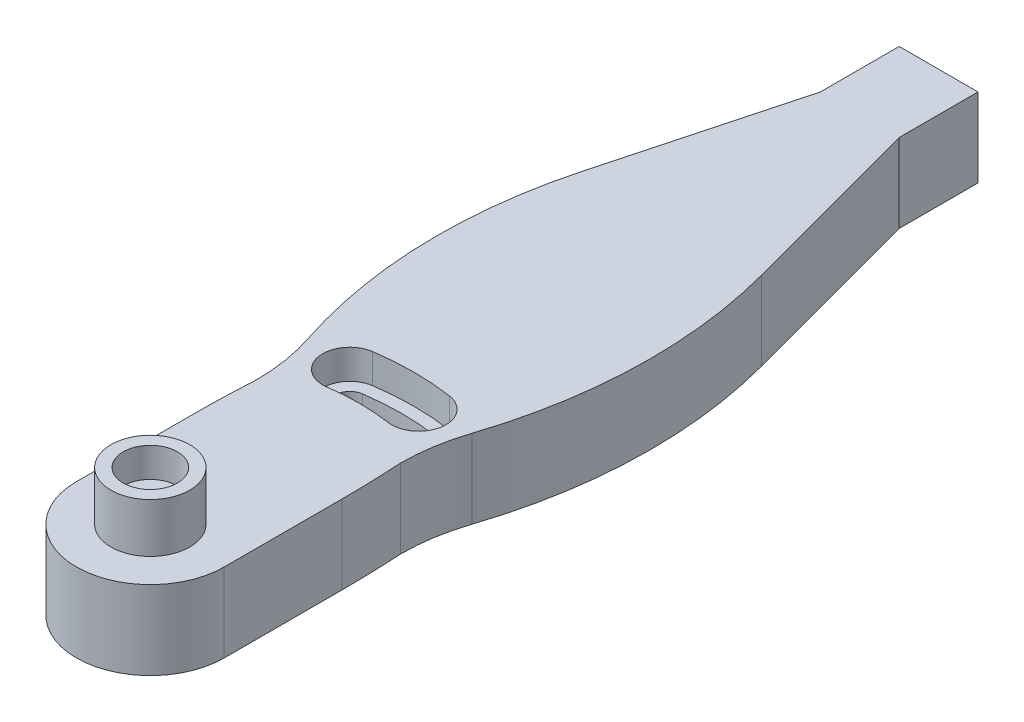
ISO-10303-21;
HEADER;
FILE_DESCRIPTION(('STEP AP214'),'2;1');
FILE_NAME('part.step','',(''),(''),'','','');
FILE_SCHEMA(('AUTOMOTIVE_DESIGN { 1 0 10303 214 1 1 1 1 }'));
ENDSEC;
DATA;
#1=APPLICATION_CONTEXT('core data for automotive mechanical design processes');
#2=APPLICATION_PROTOCOL_DEFINITION('international standard','automotive_design',2000,#1);
#3=PRODUCT_CONTEXT('',#1,'mechanical');
#4=PRODUCT('Part','Part','',(#3));
#5=PRODUCT_RELATED_PRODUCT_CATEGORY('part','',(#4));
#6=PRODUCT_DEFINITION_FORMATION('','',#4);
#7=PRODUCT_DEFINITION_CONTEXT('part definition',#1,'design');
#8=PRODUCT_DEFINITION('design','',#6,#7);
#9=PRODUCT_DEFINITION_SHAPE('','',#8);
#10=(LENGTH_UNIT() NAMED_UNIT(*) SI_UNIT(.MILLI.,.METRE.));
#11=(NAMED_UNIT(*) PLANE_ANGLE_UNIT() SI_UNIT($,.RADIAN.));
#12=(NAMED_UNIT(*) SI_UNIT($,.STERADIAN.) SOLID_ANGLE_UNIT());
#13=UNCERTAINTY_MEASURE_WITH_UNIT(LENGTH_MEASURE(1.E-05),#10,'distance_accuracy_value','');
#14=(GEOMETRIC_REPRESENTATION_CONTEXT(3) GLOBAL_UNCERTAINTY_ASSIGNED_CONTEXT((#13)) GLOBAL_UNIT_ASSIGNED_CONTEXT((#10,
#11,#12)) REPRESENTATION_CONTEXT('',''));
#15=CARTESIAN_POINT('',(0.,0.,0.));
#16=DIRECTION('',(0.,0.,1.));
#17=DIRECTION('',(1.,0.,0.));
#18=AXIS2_PLACEMENT_3D('',#15,#16,#17);
#19=CARTESIAN_POINT('',(0.,8.,0.));
#20=DIRECTION('',(0.,-1.,0.));
#21=DIRECTION('',(0.,0.,-1.));
#22=AXIS2_PLACEMENT_3D('',#19,#20,#21);
#23=CYLINDRICAL_SURFACE('',#22,25.5);
#24=DIRECTION('',(0.,-1.,0.));
#25=VECTOR('',#24,1.);
#26=CARTESIAN_POINT('',(3.71875,8.,-25.2273838999905));
#27=LINE('',#26,#25);
#28=CARTESIAN_POINT('',(3.71875,5.,-25.2273838999905));
#29=VERTEX_POINT('',#28);
#30=CARTESIAN_POINT('',(3.71875,0.,-25.2273838999905));
#31=VERTEX_POINT('',#30);
#32=EDGE_CURVE('E51',#29,#31,#27,.T.);
#33=ORIENTED_EDGE('',*,*,#32,.F.);
#34=CARTESIAN_POINT('',(0.,5.,0.));
#35=DIRECTION('',(0.,1.,0.));
#36=DIRECTION('',(0.,0.,1.));
#37=AXIS2_PLACEMENT_3D('',#34,#35,#36);
#38=CIRCLE('',#37,25.5);
#39=CARTESIAN_POINT('',(-3.71875,5.,-25.2273838999905));
#40=VERTEX_POINT('',#39);
#41=EDGE_CURVE('E233',#29,#40,#38,.T.);
#42=ORIENTED_EDGE('',*,*,#41,.T.);
#43=DIRECTION('',(0.,-1.,0.));
#44=VECTOR('',#43,1.);
#45=CARTESIAN_POINT('',(-3.71875,8.,-25.2273838999905));
#46=LINE('',#45,#44);
#47=CARTESIAN_POINT('',(-3.71875,0.,-25.2273838999905));
#48=VERTEX_POINT('',#47);
#49=EDGE_CURVE('E344',#40,#48,#46,.T.);
#50=ORIENTED_EDGE('',*,*,#49,.T.);
#51=CARTESIAN_POINT('',(0.,0.,0.));
#52=DIRECTION('',(0.,1.,0.));
#53=DIRECTION('',(0.,0.,1.));
#54=AXIS2_PLACEMENT_3D('',#51,#52,#53);
#55=CIRCLE('',#54,25.5);
#56=EDGE_CURVE('E330',#31,#48,#55,.T.);
#57=ORIENTED_EDGE('',*,*,#56,.F.);
#58=EDGE_LOOP('',(#33,#42,#50,#57));
#59=FACE_BOUND('',#58,.T.);
#60=ADVANCED_FACE('F43',(#59),#23,.F.);
#61=CARTESIAN_POINT('',(3.5,8.,-23.7434201411675));
#62=DIRECTION('',(0.,-1.,0.));
#63=DIRECTION('',(0.,0.,-1.));
#64=AXIS2_PLACEMENT_3D('',#61,#62,#63);
#65=CYLINDRICAL_SURFACE('',#64,1.5);
#66=DIRECTION('',(0.,-1.,0.));
#67=VECTOR('',#66,1.);
#68=CARTESIAN_POINT('',(3.28125,8.,-22.2594563823446));
#69=LINE('',#68,#67);
#70=CARTESIAN_POINT('',(3.28125,5.,-22.2594563823446));
#71=VERTEX_POINT('',#70);
#72=CARTESIAN_POINT('',(3.28125,0.,-22.2594563823446));
#73=VERTEX_POINT('',#72);
#74=EDGE_CURVE('E349',#71,#73,#69,.T.);
#75=ORIENTED_EDGE('',*,*,#74,.F.);
#76=CARTESIAN_POINT('',(3.5,5.,-23.7434201411675));
#77=DIRECTION('',(0.,1.,0.));
#78=DIRECTION('',(0.,0.,1.));
#79=AXIS2_PLACEMENT_3D('',#76,#77,#78);
#80=CIRCLE('',#79,1.5);
#81=EDGE_CURVE('E230',#71,#29,#80,.T.);
#82=ORIENTED_EDGE('',*,*,#81,.T.);
#83=ORIENTED_EDGE('',*,*,#32,.T.);
#84=CARTESIAN_POINT('',(3.5,0.,-23.7434201411675));
#85=DIRECTION('',(0.,1.,0.));
#86=DIRECTION('',(0.,0.,1.));
#87=AXIS2_PLACEMENT_3D('',#84,#85,#86);
#88=CIRCLE('',#87,1.5);
#89=EDGE_CURVE('E333',#73,#31,#88,.T.);
#90=ORIENTED_EDGE('',*,*,#89,.F.);
#91=EDGE_LOOP('',(#75,#82,#83,#90));
#92=FACE_BOUND('',#91,.T.);
#93=ADVANCED_FACE('F453',(#92),#65,.F.);
#94=CARTESIAN_POINT('',(0.,8.,0.));
#95=DIRECTION('',(0.,-1.,0.));
#96=DIRECTION('',(0.,0.,-1.));
#97=AXIS2_PLACEMENT_3D('',#94,#95,#96);
#98=CYLINDRICAL_SURFACE('',#97,22.5);
#99=CARTESIAN_POINT('',(0.,5.,0.));
#100=DIRECTION('',(0.,1.,0.));
#101=DIRECTION('',(0.,0.,1.));
#102=AXIS2_PLACEMENT_3D('',#99,#100,#101);
#103=CIRCLE('',#102,22.5);
#104=CARTESIAN_POINT('',(-3.28125,5.,-22.2594563823446));
#105=VERTEX_POINT('',#104);
#106=EDGE_CURVE('E66',#71,#105,#103,.T.);
#107=ORIENTED_EDGE('',*,*,#106,.F.);
#108=ORIENTED_EDGE('',*,*,#74,.T.);
#109=CARTESIAN_POINT('',(0.,0.,0.));
#110=DIRECTION('',(0.,1.,0.));
#111=DIRECTION('',(0.,0.,1.));
#112=AXIS2_PLACEMENT_3D('',#109,#110,#111);
#113=CIRCLE('',#112,22.5);
#114=CARTESIAN_POINT('',(-3.28125,0.,-22.2594563823446));
#115=VERTEX_POINT('',#114);
#116=EDGE_CURVE('E336',#73,#115,#113,.T.);
#117=ORIENTED_EDGE('',*,*,#116,.T.);
#118=DIRECTION('',(0.,-1.,0.));
#119=VECTOR('',#118,1.);
#120=CARTESIAN_POINT('',(-3.28125,8.,-22.2594563823446));
#121=LINE('',#120,#119);
#122=EDGE_CURVE('E346',#105,#115,#121,.T.);
#123=ORIENTED_EDGE('',*,*,#122,.F.);
#124=EDGE_LOOP('',(#107,#108,#117,#123));
#125=FACE_BOUND('',#124,.T.);
#126=ADVANCED_FACE('F459',(#125),#98,.T.);
#127=CARTESIAN_POINT('',(-3.5,8.,-23.7434201411675));
#128=DIRECTION('',(0.,-1.,0.));
#129=DIRECTION('',(0.,0.,-1.));
#130=AXIS2_PLACEMENT_3D('',#127,#128,#129);
#131=CYLINDRICAL_SURFACE('',#130,1.5);
#132=ORIENTED_EDGE('',*,*,#49,.F.);
#133=CARTESIAN_POINT('',(-3.5,5.,-23.7434201411675));
#134=DIRECTION('',(0.,1.,0.));
#135=DIRECTION('',(0.,0.,1.));
#136=AXIS2_PLACEMENT_3D('',#133,#134,#135);
#137=CIRCLE('',#136,1.5);
#138=EDGE_CURVE('E11',#40,#105,#137,.T.);
#139=ORIENTED_EDGE('',*,*,#138,.T.);
#140=ORIENTED_EDGE('',*,*,#122,.T.);
#141=CARTESIAN_POINT('',(-3.5,0.,-23.7434201411675));
#142=DIRECTION('',(0.,1.,0.));
#143=DIRECTION('',(0.,0.,1.));
#144=AXIS2_PLACEMENT_3D('',#141,#142,#143);
#145=CIRCLE('',#144,1.5);
#146=EDGE_CURVE('E339',#48,#115,#145,.T.);
#147=ORIENTED_EDGE('',*,*,#146,.F.);
#148=EDGE_LOOP('',(#132,#139,#140,#147));
#149=FACE_BOUND('',#148,.T.);
#150=ADVANCED_FACE('F631',(#149),#131,.F.);
#151=CARTESIAN_POINT('',(0.,10.,0.));
#152=DIRECTION('',(0.,1.,0.));
#153=DIRECTION('',(0.,0.,1.));
#154=AXIS2_PLACEMENT_3D('',#151,#152,#153);
#155=PLANE('',#154);
#156=CARTESIAN_POINT('',(0.,10.,0.));
#157=DIRECTION('',(0.,1.,0.));
#158=DIRECTION('',(0.,0.,1.));
#159=AXIS2_PLACEMENT_3D('',#156,#157,#158);
#160=CIRCLE('',#159,1.5);
#161=CARTESIAN_POINT('',(0.,10.,1.5));
#162=VERTEX_POINT('',#161);
#163=EDGE_CURVE('E245',#162,#162,#160,.T.);
#164=ORIENTED_EDGE('',*,*,#163,.F.);
#165=EDGE_LOOP('',(#164));
#166=FACE_BOUND('',#165,.T.);
#167=CARTESIAN_POINT('',(0.,10.,0.));
#168=DIRECTION('',(0.,1.,0.));
#169=DIRECTION('',(0.,0.,1.));
#170=AXIS2_PLACEMENT_3D('',#167,#168,#169);
#171=CIRCLE('',#170,2.75);
#172=CARTESIAN_POINT('',(0.,10.,2.75));
#173=VERTEX_POINT('',#172);
#174=EDGE_CURVE('E236',#173,#173,#171,.T.);
#175=ORIENTED_EDGE('',*,*,#174,.T.);
#176=EDGE_LOOP('',(#175));
#177=FACE_BOUND('',#176,.T.);
#178=ADVANCED_FACE('F639',(#166,#177),#155,.T.);
#179=CARTESIAN_POINT('',(0.,8.,0.));
#180=DIRECTION('',(0.,1.,0.));
#181=DIRECTION('',(0.,0.,1.));
#182=AXIS2_PLACEMENT_3D('',#179,#180,#181);
#183=PLANE('',#182);
#184=CARTESIAN_POINT('',(0.,8.,0.));
#185=DIRECTION('',(0.,-1.,0.));
#186=DIRECTION('',(0.,0.,1.));
#187=AXIS2_PLACEMENT_3D('',#184,#185,#186);
#188=CIRCLE('',#187,21.25);
#189=CARTESIAN_POINT('',(-3.09895833333333,8.,-21.0228199166588));
#190=VERTEX_POINT('',#189);
#191=CARTESIAN_POINT('',(3.09895833333333,8.,-21.0228199166588));
#192=VERTEX_POINT('',#191);
#193=EDGE_CURVE('E58',#190,#192,#188,.T.);
#194=ORIENTED_EDGE('',*,*,#193,.F.);
#195=CARTESIAN_POINT('',(-3.5,8.,-23.7434201411675));
#196=DIRECTION('',(0.,1.,0.));
#197=DIRECTION('',(0.,0.,1.));
#198=AXIS2_PLACEMENT_3D('',#195,#196,#197);
#199=CIRCLE('',#198,2.75);
#200=CARTESIAN_POINT('',(-3.90104166666667,8.,-26.4640203656763));
#201=VERTEX_POINT('',#200);
#202=EDGE_CURVE('E211',#201,#190,#199,.T.);
#203=ORIENTED_EDGE('',*,*,#202,.F.);
#204=CARTESIAN_POINT('',(0.,8.,0.));
#205=DIRECTION('',(0.,1.,0.));
#206=DIRECTION('',(0.,0.,1.));
#207=AXIS2_PLACEMENT_3D('',#204,#205,#206);
#208=CIRCLE('',#207,26.75);
#209=CARTESIAN_POINT('',(3.90104166666667,8.,-26.4640203656763));
#210=VERTEX_POINT('',#209);
#211=EDGE_CURVE('E214',#210,#201,#208,.T.);
#212=ORIENTED_EDGE('',*,*,#211,.F.);
#213=CARTESIAN_POINT('',(3.5,8.,-23.7434201411675));
#214=DIRECTION('',(0.,1.,0.));
#215=DIRECTION('',(0.,0.,1.));
#216=AXIS2_PLACEMENT_3D('',#213,#214,#215);
#217=CIRCLE('',#216,2.75);
#218=EDGE_CURVE('E220',#192,#210,#217,.T.);
#219=ORIENTED_EDGE('',*,*,#218,.F.);
#220=EDGE_LOOP('',(#194,#203,#212,#219));
#221=FACE_BOUND('',#220,.T.);
#222=CARTESIAN_POINT('',(39.1768262293694,8.,-39.9529439397651));
#223=DIRECTION('',(0.,1.,0.));
#224=DIRECTION('',(0.,0.,1.));
#225=AXIS2_PLACEMENT_3D('',#222,#223,#224);
#226=CIRCLE('',#225,50.);
#227=CARTESIAN_POINT('',(-8.31520099184699,8.,-24.3162131299302));
#228=VERTEX_POINT('',#227);
#229=CARTESIAN_POINT('',(-9.11946508508407,8.,-52.8938961948908));
#230=VERTEX_POINT('',#229);
#231=EDGE_CURVE('E252',#228,#230,#226,.F.);
#232=ORIENTED_EDGE('',*,*,#231,.F.);
#233=CARTESIAN_POINT('',(-27.3120118803336,8.,-18.0615208059963));
#234=DIRECTION('',(0.,1.,0.));
#235=DIRECTION('',(0.,0.,1.));
#236=AXIS2_PLACEMENT_3D('',#233,#234,#235);
#237=CIRCLE('',#236,20.);
#238=CARTESIAN_POINT('',(-7.31201188033354,8.,-18.0615208059967));
#239=VERTEX_POINT('',#238);
#240=EDGE_CURVE('E255',#239,#228,#237,.T.);
#241=ORIENTED_EDGE('',*,*,#240,.F.);
#242=CARTESIAN_POINT('',(92.5,8.,-11.9327130589583));
#243=DIRECTION('',(0.,1.,0.));
#244=DIRECTION('',(0.,0.,1.));
#245=AXIS2_PLACEMENT_3D('',#242,#243,#244);
#246=CIRCLE('',#245,100.);
#247=CARTESIAN_POINT('',(-7.5,8.,-11.932713058958));
#248=VERTEX_POINT('',#247);
#249=EDGE_CURVE('E259',#248,#239,#246,.F.);
#250=ORIENTED_EDGE('',*,*,#249,.F.);
#251=DIRECTION('',(0.,0.,-1.));
#252=VECTOR('',#251,1.);
#253=CARTESIAN_POINT('',(-7.5,8.,0.));
#254=LINE('',#253,#252);
#255=CARTESIAN_POINT('',(-7.5,8.,0.));
#256=VERTEX_POINT('',#255);
#257=EDGE_CURVE('E262',#256,#248,#254,.T.);
#258=ORIENTED_EDGE('',*,*,#257,.F.);
#259=CARTESIAN_POINT('',(0.,8.,0.));
#260=DIRECTION('',(0.,1.,0.));
#261=DIRECTION('',(0.,0.,1.));
#262=AXIS2_PLACEMENT_3D('',#259,#260,#261);
#263=CIRCLE('',#262,7.5);
#264=CARTESIAN_POINT('',(7.5,8.,0.));
#265=VERTEX_POINT('',#264);
#266=EDGE_CURVE('E265',#256,#265,#263,.T.);
#267=ORIENTED_EDGE('',*,*,#266,.T.);
#268=DIRECTION('',(0.,0.,-1.));
#269=VECTOR('',#268,1.);
#270=CARTESIAN_POINT('',(7.5,8.,0.));
#271=LINE('',#270,#269);
#272=CARTESIAN_POINT('',(7.5,8.,-11.932713058958));
#273=VERTEX_POINT('',#272);
#274=EDGE_CURVE('E267',#265,#273,#271,.T.);
#275=ORIENTED_EDGE('',*,*,#274,.T.);
#276=CARTESIAN_POINT('',(-92.5,8.,-11.9327130589583));
#277=DIRECTION('',(0.,1.,0.));
#278=DIRECTION('',(0.,0.,1.));
#279=AXIS2_PLACEMENT_3D('',#276,#277,#278);
#280=CIRCLE('',#279,100.);
#281=CARTESIAN_POINT('',(7.31201188033354,8.,-18.0615208059967));
#282=VERTEX_POINT('',#281);
#283=EDGE_CURVE('E269',#273,#282,#280,.T.);
#284=ORIENTED_EDGE('',*,*,#283,.T.);
#285=CARTESIAN_POINT('',(27.3120118803336,8.,-18.0615208059963));
#286=DIRECTION('',(0.,1.,0.));
#287=DIRECTION('',(0.,0.,1.));
#288=AXIS2_PLACEMENT_3D('',#285,#286,#287);
#289=CIRCLE('',#288,20.);
#290=CARTESIAN_POINT('',(8.31520099184698,8.,-24.3162131299302));
#291=VERTEX_POINT('',#290);
#292=EDGE_CURVE('E271',#291,#282,#289,.T.);
#293=ORIENTED_EDGE('',*,*,#292,.F.);
#294=CARTESIAN_POINT('',(-39.1768262293694,8.,-39.952943939765));
#295=DIRECTION('',(0.,1.,0.));
#296=DIRECTION('',(0.,0.,1.));
#297=AXIS2_PLACEMENT_3D('',#294,#295,#296);
#298=CIRCLE('',#297,50.);
#299=CARTESIAN_POINT('',(9.11946508508407,8.,-52.8938961948908));
#300=VERTEX_POINT('',#299);
#301=EDGE_CURVE('E274',#291,#300,#298,.T.);
#302=ORIENTED_EDGE('',*,*,#301,.T.);
#303=DIRECTION('',(0.258819045102514,0.,0.96592582628907));
#304=VECTOR('',#303,1.);
#305=CARTESIAN_POINT('',(21.7320508075685,8.,-5.82308546375995));
#306=LINE('',#305,#304);
#307=CARTESIAN_POINT('',(3.99999999999999,8.,-72.));
#308=VERTEX_POINT('',#307);
#309=EDGE_CURVE('E276',#308,#300,#306,.T.);
#310=ORIENTED_EDGE('',*,*,#309,.F.);
#311=DIRECTION('',(0.,0.,1.));
#312=VECTOR('',#311,1.);
#313=CARTESIAN_POINT('',(4.00000000000001,8.,0.));
#314=LINE('',#313,#312);
#315=CARTESIAN_POINT('',(3.99999999999999,8.,-80.));
#316=VERTEX_POINT('',#315);
#317=EDGE_CURVE('E279',#316,#308,#314,.T.);
#318=ORIENTED_EDGE('',*,*,#317,.F.);
#319=DIRECTION('',(1.,0.,0.));
#320=VECTOR('',#319,1.);
#321=CARTESIAN_POINT('',(0.,8.,-80.));
#322=LINE('',#321,#320);
#323=CARTESIAN_POINT('',(-4.00000000000001,8.,-80.));
#324=VERTEX_POINT('',#323);
#325=EDGE_CURVE('E282',#324,#316,#322,.T.);
#326=ORIENTED_EDGE('',*,*,#325,.F.);
#327=DIRECTION('',(0.,0.,-1.));
#328=VECTOR('',#327,1.);
#329=CARTESIAN_POINT('',(-4.00000000000001,8.,0.));
#330=LINE('',#329,#328);
#331=CARTESIAN_POINT('',(-4.00000000000001,8.,-72.));
#332=VERTEX_POINT('',#331);
#333=EDGE_CURVE('E285',#332,#324,#330,.T.);
#334=ORIENTED_EDGE('',*,*,#333,.F.);
#335=DIRECTION('',(-0.258819045102514,0.,0.96592582628907));
#336=VECTOR('',#335,1.);
#337=CARTESIAN_POINT('',(-21.7320508075685,8.,-5.82308546375995));
#338=LINE('',#337,#336);
#339=EDGE_CURVE('E288',#332,#230,#338,.T.);
#340=ORIENTED_EDGE('',*,*,#339,.T.);
#341=EDGE_LOOP('',(#232,#241,#250,#258,#267,#275,#284,#293,#302,#310,#318,#326,#334,#340));
#342=FACE_BOUND('',#341,.T.);
#343=CARTESIAN_POINT('',(0.,8.,0.));
#344=DIRECTION('',(0.,1.,0.));
#345=DIRECTION('',(0.,0.,1.));
#346=AXIS2_PLACEMENT_3D('',#343,#344,#345);
#347=CIRCLE('',#346,4.);
#348=CARTESIAN_POINT('',(0.,8.,4.));
#349=VERTEX_POINT('',#348);
#350=EDGE_CURVE('E248',#349,#349,#347,.T.);
#351=ORIENTED_EDGE('',*,*,#350,.F.);
#352=EDGE_LOOP('',(#351));
#353=FACE_BOUND('',#352,.T.);
#354=ADVANCED_FACE('F397',(#221,#342,#353),#183,.T.);
#355=CARTESIAN_POINT('',(39.1768262293694,8.,-39.9529439397651));
#356=DIRECTION('',(0.,-1.,0.));
#357=DIRECTION('',(0.,0.,-1.));
#358=AXIS2_PLACEMENT_3D('',#355,#356,#357);
#359=CYLINDRICAL_SURFACE('',#358,50.);
#360=CARTESIAN_POINT('',(39.1768262293694,0.,-39.9529439397651));
#361=DIRECTION('',(0.,1.,0.));
#362=DIRECTION('',(0.,0.,1.));
#363=AXIS2_PLACEMENT_3D('',#360,#361,#362);
#364=CIRCLE('',#363,50.);
#365=CARTESIAN_POINT('',(-8.31520099184699,0.,-24.3162131299302));
#366=VERTEX_POINT('',#365);
#367=CARTESIAN_POINT('',(-9.11946508508407,0.,-52.8938961948908));
#368=VERTEX_POINT('',#367);
#369=EDGE_CURVE('E251',#366,#368,#364,.F.);
#370=ORIENTED_EDGE('',*,*,#369,.F.);
#371=DIRECTION('',(0.,-1.,0.));
#372=VECTOR('',#371,1.);
#373=CARTESIAN_POINT('',(-8.31520099184699,8.,-24.3162131299302));
#374=LINE('',#373,#372);
#375=EDGE_CURVE('E347',#228,#366,#374,.T.);
#376=ORIENTED_EDGE('',*,*,#375,.F.);
#377=ORIENTED_EDGE('',*,*,#231,.T.);
#378=DIRECTION('',(0.,-1.,0.));
#379=VECTOR('',#378,1.);
#380=CARTESIAN_POINT('',(-9.11946508508407,8.,-52.8938961948908));
#381=LINE('',#380,#379);
#382=EDGE_CURVE('E290',#230,#368,#381,.T.);
#383=ORIENTED_EDGE('',*,*,#382,.T.);
#384=EDGE_LOOP('',(#370,#376,#377,#383));
#385=FACE_BOUND('',#384,.T.);
#386=ADVANCED_FACE('F45',(#385),#359,.T.);
#387=CARTESIAN_POINT('',(-27.3120118803336,8.,-18.0615208059963));
#388=DIRECTION('',(0.,-1.,0.));
#389=DIRECTION('',(0.,0.,-1.));
#390=AXIS2_PLACEMENT_3D('',#387,#388,#389);
#391=CYLINDRICAL_SURFACE('',#390,20.);
#392=CARTESIAN_POINT('',(-27.3120118803336,0.,-18.0615208059963));
#393=DIRECTION('',(0.,1.,0.));
#394=DIRECTION('',(0.,0.,1.));
#395=AXIS2_PLACEMENT_3D('',#392,#393,#394);
#396=CIRCLE('',#395,20.);
#397=CARTESIAN_POINT('',(-7.31201188033354,0.,-18.0615208059967));
#398=VERTEX_POINT('',#397);
#399=EDGE_CURVE('E293',#398,#366,#396,.T.);
#400=ORIENTED_EDGE('',*,*,#399,.F.);
#401=DIRECTION('',(0.,-1.,0.));
#402=VECTOR('',#401,1.);
#403=CARTESIAN_POINT('',(-7.31201188033354,8.,-18.0615208059967));
#404=LINE('',#403,#402);
#405=EDGE_CURVE('E377',#239,#398,#404,.T.);
#406=ORIENTED_EDGE('',*,*,#405,.F.);
#407=ORIENTED_EDGE('',*,*,#240,.T.);
#408=ORIENTED_EDGE('',*,*,#375,.T.);
#409=EDGE_LOOP('',(#400,#406,#407,#408));
#410=FACE_BOUND('',#409,.T.);
#411=ADVANCED_FACE('F381',(#410),#391,.F.);
#412=CARTESIAN_POINT('',(92.5,8.,-11.9327130589583));
#413=DIRECTION('',(0.,-1.,0.));
#414=DIRECTION('',(0.,0.,-1.));
#415=AXIS2_PLACEMENT_3D('',#412,#413,#414);
#416=CYLINDRICAL_SURFACE('',#415,100.);
#417=CARTESIAN_POINT('',(92.5,0.,-11.9327130589583));
#418=DIRECTION('',(0.,1.,0.));
#419=DIRECTION('',(0.,0.,1.));
#420=AXIS2_PLACEMENT_3D('',#417,#418,#419);
#421=CIRCLE('',#420,100.);
#422=CARTESIAN_POINT('',(-7.5,0.,-11.932713058958));
#423=VERTEX_POINT('',#422);
#424=EDGE_CURVE('E296',#423,#398,#421,.F.);
#425=ORIENTED_EDGE('',*,*,#424,.F.);
#426=DIRECTION('',(0.,-1.,0.));
#427=VECTOR('',#426,1.);
#428=CARTESIAN_POINT('',(-7.5,8.,-11.932713058958));
#429=LINE('',#428,#427);
#430=EDGE_CURVE('E375',#248,#423,#429,.T.);
#431=ORIENTED_EDGE('',*,*,#430,.F.);
#432=ORIENTED_EDGE('',*,*,#249,.T.);
#433=ORIENTED_EDGE('',*,*,#405,.T.);
#434=EDGE_LOOP('',(#425,#431,#432,#433));
#435=FACE_BOUND('',#434,.T.);
#436=ADVANCED_FACE('F394',(#435),#416,.T.);
#437=CARTESIAN_POINT('',(-7.5,8.,0.));
#438=DIRECTION('',(-1.,0.,0.));
#439=DIRECTION('',(0.,0.,1.));
#440=AXIS2_PLACEMENT_3D('',#437,#438,#439);
#441=PLANE('',#440);
#442=DIRECTION('',(0.,0.,-1.));
#443=VECTOR('',#442,1.);
#444=CARTESIAN_POINT('',(-7.5,0.,0.));
#445=LINE('',#444,#443);
#446=CARTESIAN_POINT('',(-7.5,0.,0.));
#447=VERTEX_POINT('',#446);
#448=EDGE_CURVE('E299',#447,#423,#445,.T.);
#449=ORIENTED_EDGE('',*,*,#448,.F.);
#450=DIRECTION('',(0.,-1.,0.));
#451=VECTOR('',#450,1.);
#452=CARTESIAN_POINT('',(-7.5,8.,0.));
#453=LINE('',#452,#451);
#454=EDGE_CURVE('E373',#256,#447,#453,.T.);
#455=ORIENTED_EDGE('',*,*,#454,.F.);
#456=ORIENTED_EDGE('',*,*,#257,.T.);
#457=ORIENTED_EDGE('',*,*,#430,.T.);
#458=EDGE_LOOP('',(#449,#455,#456,#457));
#459=FACE_BOUND('',#458,.T.);
#460=ADVANCED_FACE('F443',(#459),#441,.T.);
#461=CARTESIAN_POINT('',(0.,8.,0.));
#462=DIRECTION('',(0.,-1.,0.));
#463=DIRECTION('',(0.,0.,-1.));
#464=AXIS2_PLACEMENT_3D('',#461,#462,#463);
#465=CYLINDRICAL_SURFACE('',#464,7.5);
#466=CARTESIAN_POINT('',(0.,0.,0.));
#467=DIRECTION('',(0.,1.,0.));
#468=DIRECTION('',(0.,0.,1.));
#469=AXIS2_PLACEMENT_3D('',#466,#467,#468);
#470=CIRCLE('',#469,7.5);
#471=CARTESIAN_POINT('',(7.5,0.,0.));
#472=VERTEX_POINT('',#471);
#473=EDGE_CURVE('E302',#447,#472,#470,.T.);
#474=ORIENTED_EDGE('',*,*,#473,.T.);
#475=DIRECTION('',(0.,-1.,0.));
#476=VECTOR('',#475,1.);
#477=CARTESIAN_POINT('',(7.5,8.,0.));
#478=LINE('',#477,#476);
#479=EDGE_CURVE('E370',#265,#472,#478,.T.);
#480=ORIENTED_EDGE('',*,*,#479,.F.);
#481=ORIENTED_EDGE('',*,*,#266,.F.);
#482=ORIENTED_EDGE('',*,*,#454,.T.);
#483=EDGE_LOOP('',(#474,#480,#481,#482));
#484=FACE_BOUND('',#483,.T.);
#485=ADVANCED_FACE('F441',(#484),#465,.T.);
#486=CARTESIAN_POINT('',(7.5,8.,0.));
#487=DIRECTION('',(-1.,0.,0.));
#488=DIRECTION('',(0.,0.,1.));
#489=AXIS2_PLACEMENT_3D('',#486,#487,#488);
#490=PLANE('',#489);
#491=DIRECTION('',(0.,0.,-1.));
#492=VECTOR('',#491,1.);
#493=CARTESIAN_POINT('',(7.5,0.,0.));
#494=LINE('',#493,#492);
#495=CARTESIAN_POINT('',(7.5,0.,-11.932713058958));
#496=VERTEX_POINT('',#495);
#497=EDGE_CURVE('E304',#472,#496,#494,.T.);
#498=ORIENTED_EDGE('',*,*,#497,.T.);
#499=DIRECTION('',(0.,-1.,0.));
#500=VECTOR('',#499,1.);
#501=CARTESIAN_POINT('',(7.5,8.,-11.932713058958));
#502=LINE('',#501,#500);
#503=EDGE_CURVE('E367',#273,#496,#502,.T.);
#504=ORIENTED_EDGE('',*,*,#503,.F.);
#505=ORIENTED_EDGE('',*,*,#274,.F.);
#506=ORIENTED_EDGE('',*,*,#479,.T.);
#507=EDGE_LOOP('',(#498,#504,#505,#506));
#508=FACE_BOUND('',#507,.T.);
#509=ADVANCED_FACE('F436',(#508),#490,.F.);
#510=CARTESIAN_POINT('',(-92.5,8.,-11.9327130589583));
#511=DIRECTION('',(0.,-1.,0.));
#512=DIRECTION('',(0.,0.,-1.));
#513=AXIS2_PLACEMENT_3D('',#510,#511,#512);
#514=CYLINDRICAL_SURFACE('',#513,100.);
#515=CARTESIAN_POINT('',(-92.5,0.,-11.9327130589583));
#516=DIRECTION('',(0.,1.,0.));
#517=DIRECTION('',(0.,0.,1.));
#518=AXIS2_PLACEMENT_3D('',#515,#516,#517);
#519=CIRCLE('',#518,100.);
#520=CARTESIAN_POINT('',(7.31201188033354,0.,-18.0615208059967));
#521=VERTEX_POINT('',#520);
#522=EDGE_CURVE('E306',#496,#521,#519,.T.);
#523=ORIENTED_EDGE('',*,*,#522,.T.);
#524=DIRECTION('',(0.,-1.,0.));
#525=VECTOR('',#524,1.);
#526=CARTESIAN_POINT('',(7.31201188033354,8.,-18.0615208059967));
#527=LINE('',#526,#525);
#528=EDGE_CURVE('E365',#282,#521,#527,.T.);
#529=ORIENTED_EDGE('',*,*,#528,.F.);
#530=ORIENTED_EDGE('',*,*,#283,.F.);
#531=ORIENTED_EDGE('',*,*,#503,.T.);
#532=EDGE_LOOP('',(#523,#529,#530,#531));
#533=FACE_BOUND('',#532,.T.);
#534=ADVANCED_FACE('F432',(#533),#514,.T.);
#535=CARTESIAN_POINT('',(27.3120118803336,8.,-18.0615208059963));
#536=DIRECTION('',(0.,-1.,0.));
#537=DIRECTION('',(0.,0.,-1.));
#538=AXIS2_PLACEMENT_3D('',#535,#536,#537);
#539=CYLINDRICAL_SURFACE('',#538,20.);
#540=CARTESIAN_POINT('',(27.3120118803336,0.,-18.0615208059963));
#541=DIRECTION('',(0.,1.,0.));
#542=DIRECTION('',(0.,0.,1.));
#543=AXIS2_PLACEMENT_3D('',#540,#541,#542);
#544=CIRCLE('',#543,20.);
#545=CARTESIAN_POINT('',(8.31520099184698,0.,-24.3162131299302));
#546=VERTEX_POINT('',#545);
#547=EDGE_CURVE('E309',#546,#521,#544,.T.);
#548=ORIENTED_EDGE('',*,*,#547,.F.);
#549=DIRECTION('',(0.,-1.,0.));
#550=VECTOR('',#549,1.);
#551=CARTESIAN_POINT('',(8.31520099184698,8.,-24.3162131299302));
#552=LINE('',#551,#550);
#553=EDGE_CURVE('E363',#291,#546,#552,.T.);
#554=ORIENTED_EDGE('',*,*,#553,.F.);
#555=ORIENTED_EDGE('',*,*,#292,.T.);
#556=ORIENTED_EDGE('',*,*,#528,.T.);
#557=EDGE_LOOP('',(#548,#554,#555,#556));
#558=FACE_BOUND('',#557,.T.);
#559=ADVANCED_FACE('F427',(#558),#539,.F.);
#560=CARTESIAN_POINT('',(-39.1768262293694,8.,-39.952943939765));
#561=DIRECTION('',(0.,-1.,0.));
#562=DIRECTION('',(0.,0.,-1.));
#563=AXIS2_PLACEMENT_3D('',#560,#561,#562);
#564=CYLINDRICAL_SURFACE('',#563,50.);
#565=CARTESIAN_POINT('',(-39.1768262293694,0.,-39.952943939765));
#566=DIRECTION('',(0.,1.,0.));
#567=DIRECTION('',(0.,0.,1.));
#568=AXIS2_PLACEMENT_3D('',#565,#566,#567);
#569=CIRCLE('',#568,50.);
#570=CARTESIAN_POINT('',(9.11946508508407,0.,-52.8938961948908));
#571=VERTEX_POINT('',#570);
#572=EDGE_CURVE('E312',#546,#571,#569,.T.);
#573=ORIENTED_EDGE('',*,*,#572,.T.);
#574=DIRECTION('',(0.,-1.,0.));
#575=VECTOR('',#574,1.);
#576=CARTESIAN_POINT('',(9.11946508508407,8.,-52.8938961948908));
#577=LINE('',#576,#575);
#578=EDGE_CURVE('E361',#300,#571,#577,.T.);
#579=ORIENTED_EDGE('',*,*,#578,.F.);
#580=ORIENTED_EDGE('',*,*,#301,.F.);
#581=ORIENTED_EDGE('',*,*,#553,.T.);
#582=EDGE_LOOP('',(#573,#579,#580,#581));
#583=FACE_BOUND('',#582,.T.);
#584=ADVANCED_FACE('F423',(#583),#564,.T.);
#585=CARTESIAN_POINT('',(21.7320508075685,8.,-5.82308546375995));
#586=DIRECTION('',(0.96592582628907,0.,-0.258819045102514));
#587=DIRECTION('',(-0.258819045102514,0.,-0.96592582628907));
#588=AXIS2_PLACEMENT_3D('',#585,#586,#587);
#589=PLANE('',#588);
#590=DIRECTION('',(0.258819045102514,0.,0.96592582628907));
#591=VECTOR('',#590,1.);
#592=CARTESIAN_POINT('',(21.7320508075685,0.,-5.82308546375995));
#593=LINE('',#592,#591);
#594=CARTESIAN_POINT('',(3.99999999999999,0.,-72.));
#595=VERTEX_POINT('',#594);
#596=EDGE_CURVE('E315',#595,#571,#593,.T.);
#597=ORIENTED_EDGE('',*,*,#596,.F.);
#598=DIRECTION('',(0.,-1.,0.));
#599=VECTOR('',#598,1.);
#600=CARTESIAN_POINT('',(3.99999999999999,8.,-72.));
#601=LINE('',#600,#599);
#602=EDGE_CURVE('E359',#308,#595,#601,.T.);
#603=ORIENTED_EDGE('',*,*,#602,.F.);
#604=ORIENTED_EDGE('',*,*,#309,.T.);
#605=ORIENTED_EDGE('',*,*,#578,.T.);
#606=EDGE_LOOP('',(#597,#603,#604,#605));
#607=FACE_BOUND('',#606,.T.);
#608=ADVANCED_FACE('F419',(#607),#589,.T.);
#609=CARTESIAN_POINT('',(4.00000000000001,8.,0.));
#610=DIRECTION('',(1.,0.,0.));
#611=DIRECTION('',(0.,0.,-1.));
#612=AXIS2_PLACEMENT_3D('',#609,#610,#611);
#613=PLANE('',#612);
#614=DIRECTION('',(0.,0.,1.));
#615=VECTOR('',#614,1.);
#616=CARTESIAN_POINT('',(4.00000000000001,0.,0.));
#617=LINE('',#616,#615);
#618=CARTESIAN_POINT('',(3.99999999999999,0.,-80.));
#619=VERTEX_POINT('',#618);
#620=EDGE_CURVE('E318',#619,#595,#617,.T.);
#621=ORIENTED_EDGE('',*,*,#620,.F.);
#622=DIRECTION('',(0.,-1.,0.));
#623=VECTOR('',#622,1.);
#624=CARTESIAN_POINT('',(3.99999999999999,8.,-80.));
#625=LINE('',#624,#623);
#626=EDGE_CURVE('E357',#316,#619,#625,.T.);
#627=ORIENTED_EDGE('',*,*,#626,.F.);
#628=ORIENTED_EDGE('',*,*,#317,.T.);
#629=ORIENTED_EDGE('',*,*,#602,.T.);
#630=EDGE_LOOP('',(#621,#627,#628,#629));
#631=FACE_BOUND('',#630,.T.);
#632=ADVANCED_FACE('F415',(#631),#613,.T.);
#633=CARTESIAN_POINT('',(0.,8.,-80.));
#634=DIRECTION('',(0.,0.,-1.));
#635=DIRECTION('',(-1.,0.,0.));
#636=AXIS2_PLACEMENT_3D('',#633,#634,#635);
#637=PLANE('',#636);
#638=DIRECTION('',(1.,0.,0.));
#639=VECTOR('',#638,1.);
#640=CARTESIAN_POINT('',(0.,0.,-80.));
#641=LINE('',#640,#639);
#642=CARTESIAN_POINT('',(-4.00000000000001,0.,-80.));
#643=VERTEX_POINT('',#642);
#644=EDGE_CURVE('E321',#643,#619,#641,.T.);
#645=ORIENTED_EDGE('',*,*,#644,.F.);
#646=DIRECTION('',(0.,-1.,0.));
#647=VECTOR('',#646,1.);
#648=CARTESIAN_POINT('',(-4.00000000000001,8.,-80.));
#649=LINE('',#648,#647);
#650=EDGE_CURVE('E355',#324,#643,#649,.T.);
#651=ORIENTED_EDGE('',*,*,#650,.F.);
#652=ORIENTED_EDGE('',*,*,#325,.T.);
#653=ORIENTED_EDGE('',*,*,#626,.T.);
#654=EDGE_LOOP('',(#645,#651,#652,#653));
#655=FACE_BOUND('',#654,.T.);
#656=ADVANCED_FACE('F410',(#655),#637,.T.);
#657=CARTESIAN_POINT('',(-4.00000000000001,8.,0.));
#658=DIRECTION('',(-1.,0.,0.));
#659=DIRECTION('',(0.,0.,1.));
#660=AXIS2_PLACEMENT_3D('',#657,#658,#659);
#661=PLANE('',#660);
#662=DIRECTION('',(0.,0.,-1.));
#663=VECTOR('',#662,1.);
#664=CARTESIAN_POINT('',(-4.00000000000001,0.,0.));
#665=LINE('',#664,#663);
#666=CARTESIAN_POINT('',(-4.00000000000001,0.,-72.));
#667=VERTEX_POINT('',#666);
#668=EDGE_CURVE('E324',#667,#643,#665,.T.);
#669=ORIENTED_EDGE('',*,*,#668,.F.);
#670=DIRECTION('',(0.,-1.,0.));
#671=VECTOR('',#670,1.);
#672=CARTESIAN_POINT('',(-4.00000000000001,8.,-72.));
#673=LINE('',#672,#671);
#674=EDGE_CURVE('E353',#332,#667,#673,.T.);
#675=ORIENTED_EDGE('',*,*,#674,.F.);
#676=ORIENTED_EDGE('',*,*,#333,.T.);
#677=ORIENTED_EDGE('',*,*,#650,.T.);
#678=EDGE_LOOP('',(#669,#675,#676,#677));
#679=FACE_BOUND('',#678,.T.);
#680=ADVANCED_FACE('F407',(#679),#661,.T.);
#681=CARTESIAN_POINT('',(-21.7320508075685,8.,-5.82308546375995));
#682=DIRECTION('',(0.96592582628907,0.,0.258819045102514));
#683=DIRECTION('',(0.258819045102514,0.,-0.96592582628907));
#684=AXIS2_PLACEMENT_3D('',#681,#682,#683);
#685=PLANE('',#684);
#686=DIRECTION('',(-0.258819045102514,0.,0.96592582628907));
#687=VECTOR('',#686,1.);
#688=CARTESIAN_POINT('',(-21.7320508075685,0.,-5.82308546375995));
#689=LINE('',#688,#687);
#690=EDGE_CURVE('E327',#667,#368,#689,.T.);
#691=ORIENTED_EDGE('',*,*,#690,.T.);
#692=ORIENTED_EDGE('',*,*,#382,.F.);
#693=ORIENTED_EDGE('',*,*,#339,.F.);
#694=ORIENTED_EDGE('',*,*,#674,.T.);
#695=EDGE_LOOP('',(#691,#692,#693,#694));
#696=FACE_BOUND('',#695,.T.);
#697=ADVANCED_FACE('F404',(#696),#685,.F.);
#698=CARTESIAN_POINT('',(0.,8.,0.));
#699=DIRECTION('',(0.,-1.,0.));
#700=DIRECTION('',(0.,0.,-1.));
#701=AXIS2_PLACEMENT_3D('',#698,#699,#700);
#702=CYLINDRICAL_SURFACE('',#701,1.5);
#703=CARTESIAN_POINT('',(0.,0.,0.));
#704=DIRECTION('',(0.,1.,0.));
#705=DIRECTION('',(0.,0.,1.));
#706=AXIS2_PLACEMENT_3D('',#703,#704,#705);
#707=CIRCLE('',#706,1.5);
#708=CARTESIAN_POINT('',(0.,0.,1.5));
#709=VERTEX_POINT('',#708);
#710=EDGE_CURVE('E256',#709,#709,#707,.T.);
#711=ORIENTED_EDGE('',*,*,#710,.F.);
#712=EDGE_LOOP('',(#711));
#713=FACE_BOUND('',#712,.T.);
#714=ORIENTED_EDGE('',*,*,#163,.T.);
#715=EDGE_LOOP('',(#714));
#716=FACE_BOUND('',#715,.T.);
#717=ADVANCED_FACE('F467',(#713,#716),#702,.F.);
#718=CARTESIAN_POINT('',(0.,0.,0.));
#719=DIRECTION('',(0.,1.,0.));
#720=DIRECTION('',(0.,0.,1.));
#721=AXIS2_PLACEMENT_3D('',#718,#719,#720);
#722=PLANE('',#721);
#723=ORIENTED_EDGE('',*,*,#369,.T.);
#724=ORIENTED_EDGE('',*,*,#690,.F.);
#725=ORIENTED_EDGE('',*,*,#668,.T.);
#726=ORIENTED_EDGE('',*,*,#644,.T.);
#727=ORIENTED_EDGE('',*,*,#620,.T.);
#728=ORIENTED_EDGE('',*,*,#596,.T.);
#729=ORIENTED_EDGE('',*,*,#572,.F.);
#730=ORIENTED_EDGE('',*,*,#547,.T.);
#731=ORIENTED_EDGE('',*,*,#522,.F.);
#732=ORIENTED_EDGE('',*,*,#497,.F.);
#733=ORIENTED_EDGE('',*,*,#473,.F.);
#734=ORIENTED_EDGE('',*,*,#448,.T.);
#735=ORIENTED_EDGE('',*,*,#424,.T.);
#736=ORIENTED_EDGE('',*,*,#399,.T.);
#737=EDGE_LOOP('',(#723,#724,#725,#726,#727,#728,#729,#730,#731,#732,#733,#734,#735,#736));
#738=FACE_BOUND('',#737,.T.);
#739=ORIENTED_EDGE('',*,*,#56,.T.);
#740=ORIENTED_EDGE('',*,*,#146,.T.);
#741=ORIENTED_EDGE('',*,*,#116,.F.);
#742=ORIENTED_EDGE('',*,*,#89,.T.);
#743=EDGE_LOOP('',(#739,#740,#741,#742));
#744=FACE_BOUND('',#743,.T.);
#745=ORIENTED_EDGE('',*,*,#710,.T.);
#746=EDGE_LOOP('',(#745));
#747=FACE_BOUND('',#746,.T.);
#748=ADVANCED_FACE('F388',(#738,#744,#747),#722,.F.);
#749=CARTESIAN_POINT('',(0.,10.,0.));
#750=DIRECTION('',(0.,-1.,0.));
#751=DIRECTION('',(0.,0.,-1.));
#752=AXIS2_PLACEMENT_3D('',#749,#750,#751);
#753=CYLINDRICAL_SURFACE('',#752,4.);
#754=ORIENTED_EDGE('',*,*,#350,.T.);
#755=EDGE_LOOP('',(#754));
#756=FACE_BOUND('',#755,.T.);
#757=CARTESIAN_POINT('',(0.,13.,0.));
#758=DIRECTION('',(0.,1.,0.));
#759=DIRECTION('',(0.,0.,1.));
#760=AXIS2_PLACEMENT_3D('',#757,#758,#759);
#761=CIRCLE('',#760,4.);
#762=CARTESIAN_POINT('',(0.,13.,4.));
#763=VERTEX_POINT('',#762);
#764=EDGE_CURVE('E240',#763,#763,#761,.T.);
#765=ORIENTED_EDGE('',*,*,#764,.F.);
#766=EDGE_LOOP('',(#765));
#767=FACE_BOUND('',#766,.T.);
#768=ADVANCED_FACE('F533',(#756,#767),#753,.T.);
#769=CARTESIAN_POINT('',(0.,13.,0.));
#770=DIRECTION('',(0.,1.,0.));
#771=DIRECTION('',(0.,0.,1.));
#772=AXIS2_PLACEMENT_3D('',#769,#770,#771);
#773=PLANE('',#772);
#774=ORIENTED_EDGE('',*,*,#764,.T.);
#775=EDGE_LOOP('',(#774));
#776=FACE_BOUND('',#775,.T.);
#777=CARTESIAN_POINT('',(0.,13.,0.));
#778=DIRECTION('',(0.,1.,0.));
#779=DIRECTION('',(0.,0.,1.));
#780=AXIS2_PLACEMENT_3D('',#777,#778,#779);
#781=CIRCLE('',#780,2.75);
#782=CARTESIAN_POINT('',(0.,13.,2.75));
#783=VERTEX_POINT('',#782);
#784=EDGE_CURVE('E237',#783,#783,#781,.T.);
#785=ORIENTED_EDGE('',*,*,#784,.F.);
#786=EDGE_LOOP('',(#785));
#787=FACE_BOUND('',#786,.T.);
#788=ADVANCED_FACE('F540',(#776,#787),#773,.T.);
#789=CARTESIAN_POINT('',(0.,13.,0.));
#790=DIRECTION('',(0.,-1.,0.));
#791=DIRECTION('',(0.,0.,-1.));
#792=AXIS2_PLACEMENT_3D('',#789,#790,#791);
#793=CYLINDRICAL_SURFACE('',#792,2.75);
#794=ORIENTED_EDGE('',*,*,#784,.T.);
#795=EDGE_LOOP('',(#794));
#796=FACE_BOUND('',#795,.T.);
#797=ORIENTED_EDGE('',*,*,#174,.F.);
#798=EDGE_LOOP('',(#797));
#799=FACE_BOUND('',#798,.T.);
#800=ADVANCED_FACE('F548',(#796,#799),#793,.F.);
#801=CARTESIAN_POINT('',(0.,5.,0.));
#802=DIRECTION('',(0.,1.,0.));
#803=DIRECTION('',(0.,0.,1.));
#804=AXIS2_PLACEMENT_3D('',#801,#802,#803);
#805=CYLINDRICAL_SURFACE('',#804,21.25);
#806=ORIENTED_EDGE('',*,*,#193,.T.);
#807=DIRECTION('',(0.,1.,0.));
#808=VECTOR('',#807,1.);
#809=CARTESIAN_POINT('',(3.09895833333333,5.,-21.0228199166588));
#810=LINE('',#809,#808);
#811=CARTESIAN_POINT('',(3.09895833333333,5.,-21.0228199166588));
#812=VERTEX_POINT('',#811);
#813=EDGE_CURVE('E189',#812,#192,#810,.T.);
#814=ORIENTED_EDGE('',*,*,#813,.F.);
#815=CARTESIAN_POINT('',(0.,5.,0.));
#816=DIRECTION('',(0.,-1.,0.));
#817=DIRECTION('',(0.,0.,1.));
#818=AXIS2_PLACEMENT_3D('',#815,#816,#817);
#819=CIRCLE('',#818,21.25);
#820=CARTESIAN_POINT('',(-3.09895833333333,5.,-21.0228199166588));
#821=VERTEX_POINT('',#820);
#822=EDGE_CURVE('E193',#821,#812,#819,.T.);
#823=ORIENTED_EDGE('',*,*,#822,.F.);
#824=DIRECTION('',(0.,1.,0.));
#825=VECTOR('',#824,1.);
#826=CARTESIAN_POINT('',(-3.09895833333333,5.,-21.0228199166588));
#827=LINE('',#826,#825);
#828=EDGE_CURVE('E224',#821,#190,#827,.T.);
#829=ORIENTED_EDGE('',*,*,#828,.T.);
#830=EDGE_LOOP('',(#806,#814,#823,#829));
#831=FACE_BOUND('',#830,.T.);
#832=ADVANCED_FACE('F191',(#831),#805,.T.);
#833=CARTESIAN_POINT('',(-3.5,5.,-23.7434201411675));
#834=DIRECTION('',(0.,1.,0.));
#835=DIRECTION('',(0.,0.,1.));
#836=AXIS2_PLACEMENT_3D('',#833,#834,#835);
#837=CYLINDRICAL_SURFACE('',#836,2.75);
#838=ORIENTED_EDGE('',*,*,#202,.T.);
#839=ORIENTED_EDGE('',*,*,#828,.F.);
#840=CARTESIAN_POINT('',(-3.5,5.,-23.7434201411675));
#841=DIRECTION('',(0.,1.,0.));
#842=DIRECTION('',(0.,0.,1.));
#843=AXIS2_PLACEMENT_3D('',#840,#841,#842);
#844=CIRCLE('',#843,2.75);
#845=CARTESIAN_POINT('',(-3.90104166666667,5.,-26.4640203656763));
#846=VERTEX_POINT('',#845);
#847=EDGE_CURVE('E199',#846,#821,#844,.T.);
#848=ORIENTED_EDGE('',*,*,#847,.F.);
#849=DIRECTION('',(0.,1.,0.));
#850=VECTOR('',#849,1.);
#851=CARTESIAN_POINT('',(-3.90104166666667,5.,-26.4640203656763));
#852=LINE('',#851,#850);
#853=EDGE_CURVE('E226',#846,#201,#852,.T.);
#854=ORIENTED_EDGE('',*,*,#853,.T.);
#855=EDGE_LOOP('',(#838,#839,#848,#854));
#856=FACE_BOUND('',#855,.T.);
#857=ADVANCED_FACE('F563',(#856),#837,.F.);
#858=CARTESIAN_POINT('',(0.,5.,0.));
#859=DIRECTION('',(0.,1.,0.));
#860=DIRECTION('',(0.,0.,1.));
#861=AXIS2_PLACEMENT_3D('',#858,#859,#860);
#862=CYLINDRICAL_SURFACE('',#861,26.75);
#863=ORIENTED_EDGE('',*,*,#211,.T.);
#864=ORIENTED_EDGE('',*,*,#853,.F.);
#865=CARTESIAN_POINT('',(0.,5.,0.));
#866=DIRECTION('',(0.,1.,0.));
#867=DIRECTION('',(0.,0.,1.));
#868=AXIS2_PLACEMENT_3D('',#865,#866,#867);
#869=CIRCLE('',#868,26.75);
#870=CARTESIAN_POINT('',(3.90104166666667,5.,-26.4640203656763));
#871=VERTEX_POINT('',#870);
#872=EDGE_CURVE('E207',#871,#846,#869,.T.);
#873=ORIENTED_EDGE('',*,*,#872,.F.);
#874=DIRECTION('',(0.,1.,0.));
#875=VECTOR('',#874,1.);
#876=CARTESIAN_POINT('',(3.90104166666667,5.,-26.4640203656763));
#877=LINE('',#876,#875);
#878=EDGE_CURVE('E198',#871,#210,#877,.T.);
#879=ORIENTED_EDGE('',*,*,#878,.T.);
#880=EDGE_LOOP('',(#863,#864,#873,#879));
#881=FACE_BOUND('',#880,.T.);
#882=ADVANCED_FACE('F571',(#881),#862,.F.);
#883=CARTESIAN_POINT('',(3.5,5.,-23.7434201411675));
#884=DIRECTION('',(0.,1.,0.));
#885=DIRECTION('',(0.,0.,1.));
#886=AXIS2_PLACEMENT_3D('',#883,#884,#885);
#887=CYLINDRICAL_SURFACE('',#886,2.75);
#888=ORIENTED_EDGE('',*,*,#218,.T.);
#889=ORIENTED_EDGE('',*,*,#878,.F.);
#890=CARTESIAN_POINT('',(3.5,5.,-23.7434201411675));
#891=DIRECTION('',(0.,1.,0.));
#892=DIRECTION('',(0.,0.,1.));
#893=AXIS2_PLACEMENT_3D('',#890,#891,#892);
#894=CIRCLE('',#893,2.75);
#895=EDGE_CURVE('E202',#812,#871,#894,.T.);
#896=ORIENTED_EDGE('',*,*,#895,.F.);
#897=ORIENTED_EDGE('',*,*,#813,.T.);
#898=EDGE_LOOP('',(#888,#889,#896,#897));
#899=FACE_BOUND('',#898,.T.);
#900=ADVANCED_FACE('F203',(#899),#887,.F.);
#901=CARTESIAN_POINT('',(-1.75,5.,-11.8717100705838));
#902=DIRECTION('',(0.,1.,0.));
#903=DIRECTION('',(0.,0.,1.));
#904=AXIS2_PLACEMENT_3D('',#901,#902,#903);
#905=PLANE('',#904);
#906=ORIENTED_EDGE('',*,*,#81,.F.);
#907=ORIENTED_EDGE('',*,*,#106,.T.);
#908=ORIENTED_EDGE('',*,*,#138,.F.);
#909=ORIENTED_EDGE('',*,*,#41,.F.);
#910=EDGE_LOOP('',(#906,#907,#908,#909));
#911=FACE_BOUND('',#910,.T.);
#912=ORIENTED_EDGE('',*,*,#822,.T.);
#913=ORIENTED_EDGE('',*,*,#895,.T.);
#914=ORIENTED_EDGE('',*,*,#872,.T.);
#915=ORIENTED_EDGE('',*,*,#847,.T.);
#916=EDGE_LOOP('',(#912,#913,#914,#915));
#917=FACE_BOUND('',#916,.T.);
#918=ADVANCED_FACE('F209',(#911,#917),#905,.T.);
#919=CLOSED_SHELL('',(#60,#93,#126,#150,#178,#354,#386,#411,#436,#460,#485,#509,#534,#559,#584,
#608,#632,#656,#680,#697,#717,#748,#768,#788,#800,#832,#857,#882,#900,#918));
#920=MANIFOLD_SOLID_BREP('B2',#919);
#921=ADVANCED_BREP_SHAPE_REPRESENTATION('',(#18,#920),#14);
#922=SHAPE_DEFINITION_REPRESENTATION(#9,#921);
ENDSEC;
END-ISO-10303-21;
